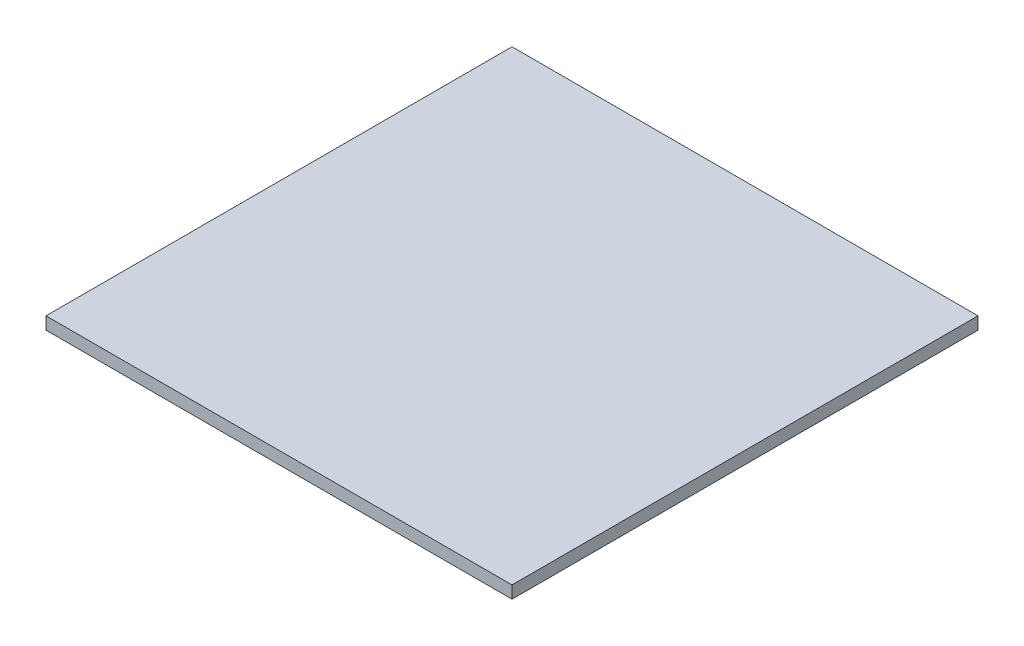
ISO-10303-21;
HEADER;
FILE_DESCRIPTION(('STEP AP214'),'2;1');
FILE_NAME('part.step','',(''),(''),'','','');
FILE_SCHEMA(('AUTOMOTIVE_DESIGN { 1 0 10303 214 1 1 1 1 }'));
ENDSEC;
DATA;
#1=APPLICATION_CONTEXT('core data for automotive mechanical design processes');
#2=APPLICATION_PROTOCOL_DEFINITION('international standard','automotive_design',2000,#1);
#3=PRODUCT_CONTEXT('',#1,'mechanical');
#4=PRODUCT('Part','Part','',(#3));
#5=PRODUCT_RELATED_PRODUCT_CATEGORY('part','',(#4));
#6=PRODUCT_DEFINITION_FORMATION('','',#4);
#7=PRODUCT_DEFINITION_CONTEXT('part definition',#1,'design');
#8=PRODUCT_DEFINITION('design','',#6,#7);
#9=PRODUCT_DEFINITION_SHAPE('','',#8);
#10=(LENGTH_UNIT() NAMED_UNIT(*) SI_UNIT(.MILLI.,.METRE.));
#11=(NAMED_UNIT(*) PLANE_ANGLE_UNIT() SI_UNIT($,.RADIAN.));
#12=(NAMED_UNIT(*) SI_UNIT($,.STERADIAN.) SOLID_ANGLE_UNIT());
#13=UNCERTAINTY_MEASURE_WITH_UNIT(LENGTH_MEASURE(1.E-05),#10,'distance_accuracy_value','');
#14=(GEOMETRIC_REPRESENTATION_CONTEXT(3) GLOBAL_UNCERTAINTY_ASSIGNED_CONTEXT((#13)) GLOBAL_UNIT_ASSIGNED_CONTEXT((#10,
#11,#12)) REPRESENTATION_CONTEXT('',''));
#15=CARTESIAN_POINT('',(0.,0.,0.));
#16=DIRECTION('',(0.,0.,1.));
#17=DIRECTION('',(1.,0.,0.));
#18=AXIS2_PLACEMENT_3D('',#15,#16,#17);
#19=CARTESIAN_POINT('',(-225.,12.,-225.));
#20=DIRECTION('',(1.,0.,0.));
#21=DIRECTION('',(0.,0.,-1.));
#22=AXIS2_PLACEMENT_3D('',#19,#20,#21);
#23=PLANE('',#22);
#24=DIRECTION('',(0.,0.,1.));
#25=VECTOR('',#24,1.);
#26=CARTESIAN_POINT('',(-225.,0.,-225.));
#27=LINE('',#26,#25);
#28=CARTESIAN_POINT('',(-225.,0.,-225.));
#29=VERTEX_POINT('',#28);
#30=CARTESIAN_POINT('',(-225.,0.,225.));
#31=VERTEX_POINT('',#30);
#32=EDGE_CURVE('E98',#29,#31,#27,.T.);
#33=ORIENTED_EDGE('',*,*,#32,.T.);
#34=DIRECTION('',(0.,-1.,0.));
#35=VECTOR('',#34,1.);
#36=CARTESIAN_POINT('',(-225.,12.,225.));
#37=LINE('',#36,#35);
#38=CARTESIAN_POINT('',(-225.,12.,225.));
#39=VERTEX_POINT('',#38);
#40=EDGE_CURVE('E11',#39,#31,#37,.T.);
#41=ORIENTED_EDGE('',*,*,#40,.F.);
#42=DIRECTION('',(0.,0.,1.));
#43=VECTOR('',#42,1.);
#44=CARTESIAN_POINT('',(-225.,12.,-225.));
#45=LINE('',#44,#43);
#46=CARTESIAN_POINT('',(-225.,12.,-225.));
#47=VERTEX_POINT('',#46);
#48=EDGE_CURVE('E86',#47,#39,#45,.T.);
#49=ORIENTED_EDGE('',*,*,#48,.F.);
#50=DIRECTION('',(0.,-1.,0.));
#51=VECTOR('',#50,1.);
#52=CARTESIAN_POINT('',(-225.,12.,-225.));
#53=LINE('',#52,#51);
#54=EDGE_CURVE('E94',#47,#29,#53,.T.);
#55=ORIENTED_EDGE('',*,*,#54,.T.);
#56=EDGE_LOOP('',(#33,#41,#49,#55));
#57=FACE_BOUND('',#56,.T.);
#58=ADVANCED_FACE('F35',(#57),#23,.F.);
#59=CARTESIAN_POINT('',(-225.,12.,225.));
#60=DIRECTION('',(0.,0.,-1.));
#61=DIRECTION('',(-1.,0.,0.));
#62=AXIS2_PLACEMENT_3D('',#59,#60,#61);
#63=PLANE('',#62);
#64=DIRECTION('',(1.,0.,0.));
#65=VECTOR('',#64,1.);
#66=CARTESIAN_POINT('',(-225.,0.,225.));
#67=LINE('',#66,#65);
#68=CARTESIAN_POINT('',(225.,0.,225.));
#69=VERTEX_POINT('',#68);
#70=EDGE_CURVE('E90',#31,#69,#67,.T.);
#71=ORIENTED_EDGE('',*,*,#70,.T.);
#72=DIRECTION('',(0.,-1.,0.));
#73=VECTOR('',#72,1.);
#74=CARTESIAN_POINT('',(225.,12.,225.));
#75=LINE('',#74,#73);
#76=CARTESIAN_POINT('',(225.,12.,225.));
#77=VERTEX_POINT('',#76);
#78=EDGE_CURVE('E43',#77,#69,#75,.T.);
#79=ORIENTED_EDGE('',*,*,#78,.F.);
#80=DIRECTION('',(1.,0.,0.));
#81=VECTOR('',#80,1.);
#82=CARTESIAN_POINT('',(-225.,12.,225.));
#83=LINE('',#82,#81);
#84=EDGE_CURVE('E81',#39,#77,#83,.T.);
#85=ORIENTED_EDGE('',*,*,#84,.F.);
#86=ORIENTED_EDGE('',*,*,#40,.T.);
#87=EDGE_LOOP('',(#71,#79,#85,#86));
#88=FACE_BOUND('',#87,.T.);
#89=ADVANCED_FACE('F89',(#88),#63,.F.);
#90=CARTESIAN_POINT('',(225.,12.,-225.));
#91=DIRECTION('',(-1.,0.,0.));
#92=DIRECTION('',(0.,0.,1.));
#93=AXIS2_PLACEMENT_3D('',#90,#91,#92);
#94=PLANE('',#93);
#95=DIRECTION('',(0.,0.,-1.));
#96=VECTOR('',#95,1.);
#97=CARTESIAN_POINT('',(225.,0.,-225.));
#98=LINE('',#97,#96);
#99=CARTESIAN_POINT('',(225.,0.,-225.));
#100=VERTEX_POINT('',#99);
#101=EDGE_CURVE('E68',#69,#100,#98,.T.);
#102=ORIENTED_EDGE('',*,*,#101,.T.);
#103=DIRECTION('',(0.,-1.,0.));
#104=VECTOR('',#103,1.);
#105=CARTESIAN_POINT('',(225.,12.,-225.));
#106=LINE('',#105,#104);
#107=CARTESIAN_POINT('',(225.,12.,-225.));
#108=VERTEX_POINT('',#107);
#109=EDGE_CURVE('E91',#108,#100,#106,.T.);
#110=ORIENTED_EDGE('',*,*,#109,.F.);
#111=DIRECTION('',(0.,0.,-1.));
#112=VECTOR('',#111,1.);
#113=CARTESIAN_POINT('',(225.,12.,-225.));
#114=LINE('',#113,#112);
#115=EDGE_CURVE('E84',#77,#108,#114,.T.);
#116=ORIENTED_EDGE('',*,*,#115,.F.);
#117=ORIENTED_EDGE('',*,*,#78,.T.);
#118=EDGE_LOOP('',(#102,#110,#116,#117));
#119=FACE_BOUND('',#118,.T.);
#120=ADVANCED_FACE('F92',(#119),#94,.F.);
#121=CARTESIAN_POINT('',(-225.,12.,-225.));
#122=DIRECTION('',(0.,0.,1.));
#123=DIRECTION('',(1.,0.,0.));
#124=AXIS2_PLACEMENT_3D('',#121,#122,#123);
#125=PLANE('',#124);
#126=DIRECTION('',(-1.,0.,0.));
#127=VECTOR('',#126,1.);
#128=CARTESIAN_POINT('',(-225.,0.,-225.));
#129=LINE('',#128,#127);
#130=EDGE_CURVE('E74',#100,#29,#129,.T.);
#131=ORIENTED_EDGE('',*,*,#130,.T.);
#132=ORIENTED_EDGE('',*,*,#54,.F.);
#133=DIRECTION('',(-1.,0.,0.));
#134=VECTOR('',#133,1.);
#135=CARTESIAN_POINT('',(-225.,12.,-225.));
#136=LINE('',#135,#134);
#137=EDGE_CURVE('E51',#108,#47,#136,.T.);
#138=ORIENTED_EDGE('',*,*,#137,.F.);
#139=ORIENTED_EDGE('',*,*,#109,.T.);
#140=EDGE_LOOP('',(#131,#132,#138,#139));
#141=FACE_BOUND('',#140,.T.);
#142=ADVANCED_FACE('F105',(#141),#125,.F.);
#143=CARTESIAN_POINT('',(0.,12.,0.));
#144=DIRECTION('',(0.,1.,0.));
#145=DIRECTION('',(0.,0.,1.));
#146=AXIS2_PLACEMENT_3D('',#143,#144,#145);
#147=PLANE('',#146);
#148=ORIENTED_EDGE('',*,*,#48,.T.);
#149=ORIENTED_EDGE('',*,*,#84,.T.);
#150=ORIENTED_EDGE('',*,*,#115,.T.);
#151=ORIENTED_EDGE('',*,*,#137,.T.);
#152=EDGE_LOOP('',(#148,#149,#150,#151));
#153=FACE_BOUND('',#152,.T.);
#154=ADVANCED_FACE('F82',(#153),#147,.T.);
#155=CARTESIAN_POINT('',(0.,0.,0.));
#156=DIRECTION('',(0.,1.,0.));
#157=DIRECTION('',(0.,0.,1.));
#158=AXIS2_PLACEMENT_3D('',#155,#156,#157);
#159=PLANE('',#158);
#160=ORIENTED_EDGE('',*,*,#32,.F.);
#161=ORIENTED_EDGE('',*,*,#130,.F.);
#162=ORIENTED_EDGE('',*,*,#101,.F.);
#163=ORIENTED_EDGE('',*,*,#70,.F.);
#164=EDGE_LOOP('',(#160,#161,#162,#163));
#165=FACE_BOUND('',#164,.T.);
#166=ADVANCED_FACE('F108',(#165),#159,.F.);
#167=CLOSED_SHELL('',(#58,#89,#120,#142,#154,#166));
#168=MANIFOLD_SOLID_BREP('B2',#167);
#169=ADVANCED_BREP_SHAPE_REPRESENTATION('',(#18,#168),#14);
#170=SHAPE_DEFINITION_REPRESENTATION(#9,#169);
ENDSEC;
END-ISO-10303-21;
